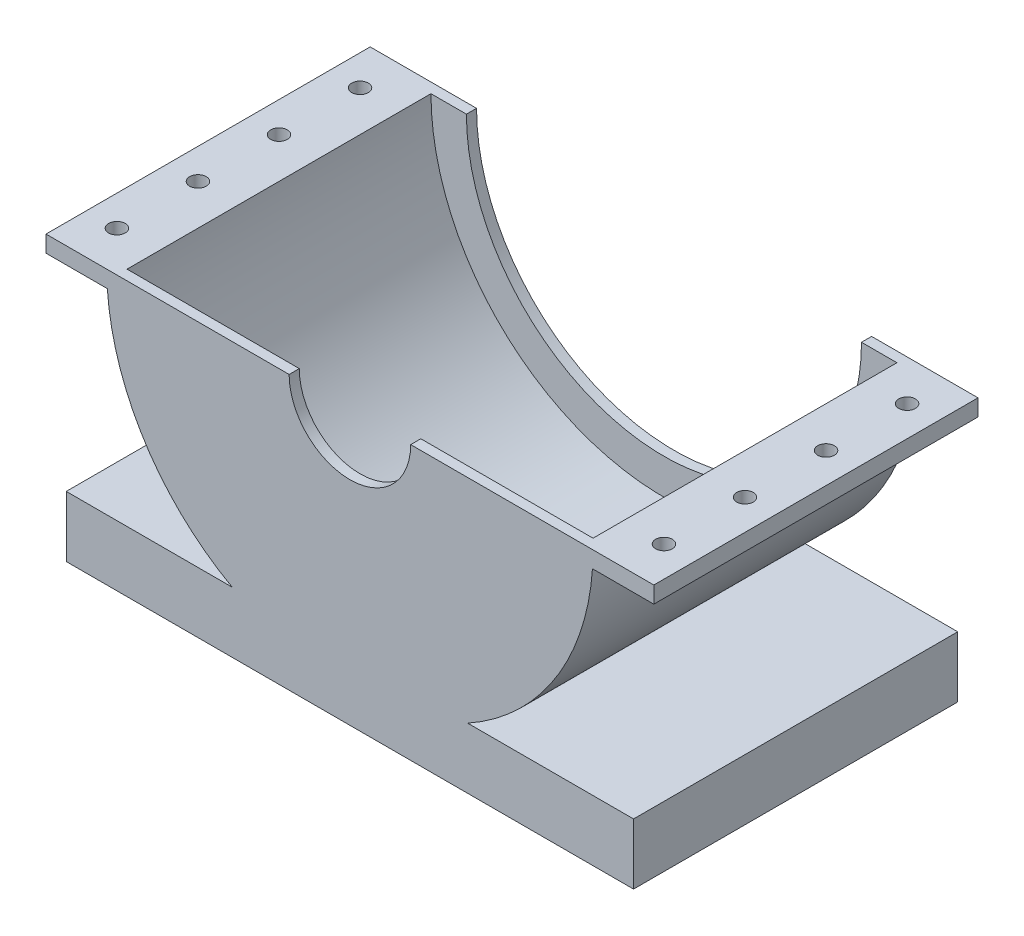
ISO-10303-21;
HEADER;
FILE_DESCRIPTION(('STEP AP214'),'2;1');
FILE_NAME('part.step','',(''),(''),'','','');
FILE_SCHEMA(('AUTOMOTIVE_DESIGN { 1 0 10303 214 1 1 1 1 }'));
ENDSEC;
DATA;
#1=APPLICATION_CONTEXT('core data for automotive mechanical design processes');
#2=APPLICATION_PROTOCOL_DEFINITION('international standard','automotive_design',2000,#1);
#3=PRODUCT_CONTEXT('',#1,'mechanical');
#4=PRODUCT('Part','Part','',(#3));
#5=PRODUCT_RELATED_PRODUCT_CATEGORY('part','',(#4));
#6=PRODUCT_DEFINITION_FORMATION('','',#4);
#7=PRODUCT_DEFINITION_CONTEXT('part definition',#1,'design');
#8=PRODUCT_DEFINITION('design','',#6,#7);
#9=PRODUCT_DEFINITION_SHAPE('','',#8);
#10=(LENGTH_UNIT() NAMED_UNIT(*) SI_UNIT(.MILLI.,.METRE.));
#11=(NAMED_UNIT(*) PLANE_ANGLE_UNIT() SI_UNIT($,.RADIAN.));
#12=(NAMED_UNIT(*) SI_UNIT($,.STERADIAN.) SOLID_ANGLE_UNIT());
#13=UNCERTAINTY_MEASURE_WITH_UNIT(LENGTH_MEASURE(1.E-05),#10,'distance_accuracy_value','');
#14=(GEOMETRIC_REPRESENTATION_CONTEXT(3) GLOBAL_UNCERTAINTY_ASSIGNED_CONTEXT((#13)) GLOBAL_UNIT_ASSIGNED_CONTEXT((#10,
#11,#12)) REPRESENTATION_CONTEXT('',''));
#15=CARTESIAN_POINT('',(0.,0.,0.));
#16=DIRECTION('',(0.,0.,1.));
#17=DIRECTION('',(1.,0.,0.));
#18=AXIS2_PLACEMENT_3D('',#15,#16,#17);
#19=CARTESIAN_POINT('',(0.,67.5,80.));
#20=DIRECTION('',(0.,0.,-1.));
#21=DIRECTION('',(-1.,0.,0.));
#22=AXIS2_PLACEMENT_3D('',#19,#20,#21);
#23=CYLINDRICAL_SURFACE('',#22,60.);
#24=CARTESIAN_POINT('',(0.,67.5,80.));
#25=DIRECTION('',(0.,0.,-1.));
#26=DIRECTION('',(-1.,0.,0.));
#27=AXIS2_PLACEMENT_3D('',#24,#25,#26);
#28=CIRCLE('',#27,60.);
#29=CARTESIAN_POINT('',(-29.0473750965557,15.,80.));
#30=VERTEX_POINT('',#29);
#31=CARTESIAN_POINT('',(-59.8597527559211,63.4,80.));
#32=VERTEX_POINT('',#31);
#33=EDGE_CURVE('E52',#30,#32,#28,.T.);
#34=ORIENTED_EDGE('',*,*,#33,.T.);
#35=DIRECTION('',(0.,0.,-1.));
#36=VECTOR('',#35,1.);
#37=CARTESIAN_POINT('',(-59.8597527559211,63.4,80.));
#38=LINE('',#37,#36);
#39=CARTESIAN_POINT('',(-59.8597527559211,63.4,0.));
#40=VERTEX_POINT('',#39);
#41=EDGE_CURVE('E47',#40,#32,#38,.F.);
#42=ORIENTED_EDGE('',*,*,#41,.F.);
#43=CARTESIAN_POINT('',(0.,67.5,0.));
#44=DIRECTION('',(0.,0.,-1.));
#45=DIRECTION('',(-1.,0.,0.));
#46=AXIS2_PLACEMENT_3D('',#43,#44,#45);
#47=CIRCLE('',#46,60.);
#48=CARTESIAN_POINT('',(-29.0473750965556,15.,0.));
#49=VERTEX_POINT('',#48);
#50=EDGE_CURVE('E281',#49,#40,#47,.T.);
#51=ORIENTED_EDGE('',*,*,#50,.F.);
#52=DIRECTION('',(0.,0.,-1.));
#53=VECTOR('',#52,1.);
#54=CARTESIAN_POINT('',(-29.0473750965557,15.,80.));
#55=LINE('',#54,#53);
#56=EDGE_CURVE('E314',#30,#49,#55,.T.);
#57=ORIENTED_EDGE('',*,*,#56,.F.);
#58=EDGE_LOOP('',(#34,#42,#51,#57));
#59=FACE_BOUND('',#58,.T.);
#60=ADVANCED_FACE('F32',(#59),#23,.T.);
#61=CARTESIAN_POINT('',(0.,67.5,80.));
#62=DIRECTION('',(0.,0.,-1.));
#63=DIRECTION('',(-1.,0.,0.));
#64=AXIS2_PLACEMENT_3D('',#61,#62,#63);
#65=CYLINDRICAL_SURFACE('',#64,57.5);
#66=DIRECTION('',(0.,0.,-1.));
#67=VECTOR('',#66,1.);
#68=CARTESIAN_POINT('',(-57.5,67.5,80.));
#69=LINE('',#68,#67);
#70=CARTESIAN_POINT('',(-57.5,67.5,77.5));
#71=VERTEX_POINT('',#70);
#72=CARTESIAN_POINT('',(-57.5,67.5,2.5));
#73=VERTEX_POINT('',#72);
#74=EDGE_CURVE('E285',#71,#73,#69,.T.);
#75=ORIENTED_EDGE('',*,*,#74,.F.);
#76=CARTESIAN_POINT('',(0.,67.5,77.5));
#77=DIRECTION('',(0.,0.,1.));
#78=DIRECTION('',(1.,0.,0.));
#79=AXIS2_PLACEMENT_3D('',#76,#77,#78);
#80=CIRCLE('',#79,57.5);
#81=CARTESIAN_POINT('',(57.5,67.5,77.5));
#82=VERTEX_POINT('',#81);
#83=EDGE_CURVE('E232',#71,#82,#80,.T.);
#84=ORIENTED_EDGE('',*,*,#83,.T.);
#85=DIRECTION('',(0.,0.,-1.));
#86=VECTOR('',#85,1.);
#87=CARTESIAN_POINT('',(57.5,67.5,80.));
#88=LINE('',#87,#86);
#89=CARTESIAN_POINT('',(57.5,67.5,2.5));
#90=VERTEX_POINT('',#89);
#91=EDGE_CURVE('E279',#82,#90,#88,.T.);
#92=ORIENTED_EDGE('',*,*,#91,.T.);
#93=CARTESIAN_POINT('',(0.,67.5,2.5));
#94=DIRECTION('',(0.,0.,-1.));
#95=DIRECTION('',(-1.,0.,0.));
#96=AXIS2_PLACEMENT_3D('',#93,#94,#95);
#97=CIRCLE('',#96,57.5);
#98=EDGE_CURVE('E258',#90,#73,#97,.T.);
#99=ORIENTED_EDGE('',*,*,#98,.T.);
#100=EDGE_LOOP('',(#75,#84,#92,#99));
#101=FACE_BOUND('',#100,.T.);
#102=ADVANCED_FACE('F351',(#101),#65,.F.);
#103=CARTESIAN_POINT('',(-70.,0.,80.));
#104=DIRECTION('',(1.,0.,0.));
#105=DIRECTION('',(0.,0.,-1.));
#106=AXIS2_PLACEMENT_3D('',#103,#104,#105);
#107=PLANE('',#106);
#108=DIRECTION('',(0.,-1.,0.));
#109=VECTOR('',#108,1.);
#110=CARTESIAN_POINT('',(-70.,0.,0.));
#111=LINE('',#110,#109);
#112=CARTESIAN_POINT('',(-70.,15.,0.));
#113=VERTEX_POINT('',#112);
#114=CARTESIAN_POINT('',(-70.,0.,0.));
#115=VERTEX_POINT('',#114);
#116=EDGE_CURVE('E287',#113,#115,#111,.T.);
#117=ORIENTED_EDGE('',*,*,#116,.T.);
#118=DIRECTION('',(0.,0.,-1.));
#119=VECTOR('',#118,1.);
#120=CARTESIAN_POINT('',(-70.,0.,80.));
#121=LINE('',#120,#119);
#122=CARTESIAN_POINT('',(-70.,0.,80.));
#123=VERTEX_POINT('',#122);
#124=EDGE_CURVE('E11',#123,#115,#121,.T.);
#125=ORIENTED_EDGE('',*,*,#124,.F.);
#126=DIRECTION('',(0.,-1.,0.));
#127=VECTOR('',#126,1.);
#128=CARTESIAN_POINT('',(-70.,0.,80.));
#129=LINE('',#128,#127);
#130=CARTESIAN_POINT('',(-70.,15.,80.));
#131=VERTEX_POINT('',#130);
#132=EDGE_CURVE('E289',#131,#123,#129,.T.);
#133=ORIENTED_EDGE('',*,*,#132,.F.);
#134=DIRECTION('',(0.,0.,-1.));
#135=VECTOR('',#134,1.);
#136=CARTESIAN_POINT('',(-70.,15.,80.));
#137=LINE('',#136,#135);
#138=EDGE_CURVE('E301',#131,#113,#137,.T.);
#139=ORIENTED_EDGE('',*,*,#138,.T.);
#140=EDGE_LOOP('',(#117,#125,#133,#139));
#141=FACE_BOUND('',#140,.T.);
#142=ADVANCED_FACE('F34',(#141),#107,.F.);
#143=CARTESIAN_POINT('',(-70.,0.,80.));
#144=DIRECTION('',(0.,1.,0.));
#145=DIRECTION('',(0.,0.,1.));
#146=AXIS2_PLACEMENT_3D('',#143,#144,#145);
#147=PLANE('',#146);
#148=DIRECTION('',(1.,0.,0.));
#149=VECTOR('',#148,1.);
#150=CARTESIAN_POINT('',(-70.,0.,0.));
#151=LINE('',#150,#149);
#152=CARTESIAN_POINT('',(70.,0.,0.));
#153=VERTEX_POINT('',#152);
#154=EDGE_CURVE('E304',#115,#153,#151,.T.);
#155=ORIENTED_EDGE('',*,*,#154,.T.);
#156=DIRECTION('',(0.,0.,-1.));
#157=VECTOR('',#156,1.);
#158=CARTESIAN_POINT('',(70.,0.,80.));
#159=LINE('',#158,#157);
#160=CARTESIAN_POINT('',(70.,0.,80.));
#161=VERTEX_POINT('',#160);
#162=EDGE_CURVE('E40',#161,#153,#159,.T.);
#163=ORIENTED_EDGE('',*,*,#162,.F.);
#164=DIRECTION('',(1.,0.,0.));
#165=VECTOR('',#164,1.);
#166=CARTESIAN_POINT('',(-70.,0.,80.));
#167=LINE('',#166,#165);
#168=EDGE_CURVE('E291',#123,#161,#167,.T.);
#169=ORIENTED_EDGE('',*,*,#168,.F.);
#170=ORIENTED_EDGE('',*,*,#124,.T.);
#171=EDGE_LOOP('',(#155,#163,#169,#170));
#172=FACE_BOUND('',#171,.T.);
#173=ADVANCED_FACE('F345',(#172),#147,.F.);
#174=CARTESIAN_POINT('',(70.,0.,80.));
#175=DIRECTION('',(-1.,0.,0.));
#176=DIRECTION('',(0.,0.,1.));
#177=AXIS2_PLACEMENT_3D('',#174,#175,#176);
#178=PLANE('',#177);
#179=DIRECTION('',(0.,1.,0.));
#180=VECTOR('',#179,1.);
#181=CARTESIAN_POINT('',(70.,0.,0.));
#182=LINE('',#181,#180);
#183=CARTESIAN_POINT('',(70.,15.,0.));
#184=VERTEX_POINT('',#183);
#185=EDGE_CURVE('E306',#153,#184,#182,.T.);
#186=ORIENTED_EDGE('',*,*,#185,.T.);
#187=DIRECTION('',(0.,0.,-1.));
#188=VECTOR('',#187,1.);
#189=CARTESIAN_POINT('',(70.,15.,80.));
#190=LINE('',#189,#188);
#191=CARTESIAN_POINT('',(70.,15.,80.));
#192=VERTEX_POINT('',#191);
#193=EDGE_CURVE('E320',#192,#184,#190,.T.);
#194=ORIENTED_EDGE('',*,*,#193,.F.);
#195=DIRECTION('',(0.,1.,0.));
#196=VECTOR('',#195,1.);
#197=CARTESIAN_POINT('',(70.,0.,80.));
#198=LINE('',#197,#196);
#199=EDGE_CURVE('E294',#161,#192,#198,.T.);
#200=ORIENTED_EDGE('',*,*,#199,.F.);
#201=ORIENTED_EDGE('',*,*,#162,.T.);
#202=EDGE_LOOP('',(#186,#194,#200,#201));
#203=FACE_BOUND('',#202,.T.);
#204=ADVANCED_FACE('F327',(#203),#178,.F.);
#205=CARTESIAN_POINT('',(29.0473750965556,15.,80.));
#206=DIRECTION('',(0.,-1.,0.));
#207=DIRECTION('',(0.,0.,-1.));
#208=AXIS2_PLACEMENT_3D('',#205,#206,#207);
#209=PLANE('',#208);
#210=DIRECTION('',(-1.,0.,0.));
#211=VECTOR('',#210,1.);
#212=CARTESIAN_POINT('',(29.0473750965556,15.,0.));
#213=LINE('',#212,#211);
#214=CARTESIAN_POINT('',(29.0473750965556,15.,0.));
#215=VERTEX_POINT('',#214);
#216=EDGE_CURVE('E308',#184,#215,#213,.T.);
#217=ORIENTED_EDGE('',*,*,#216,.T.);
#218=DIRECTION('',(0.,0.,-1.));
#219=VECTOR('',#218,1.);
#220=CARTESIAN_POINT('',(29.0473750965556,15.,80.));
#221=LINE('',#220,#219);
#222=CARTESIAN_POINT('',(29.0473750965556,15.,80.));
#223=VERTEX_POINT('',#222);
#224=EDGE_CURVE('E317',#223,#215,#221,.T.);
#225=ORIENTED_EDGE('',*,*,#224,.F.);
#226=DIRECTION('',(-1.,0.,0.));
#227=VECTOR('',#226,1.);
#228=CARTESIAN_POINT('',(29.0473750965556,15.,80.));
#229=LINE('',#228,#227);
#230=EDGE_CURVE('E296',#192,#223,#229,.T.);
#231=ORIENTED_EDGE('',*,*,#230,.F.);
#232=ORIENTED_EDGE('',*,*,#193,.T.);
#233=EDGE_LOOP('',(#217,#225,#231,#232));
#234=FACE_BOUND('',#233,.T.);
#235=ADVANCED_FACE('F337',(#234),#209,.F.);
#236=CARTESIAN_POINT('',(-70.,15.,80.));
#237=DIRECTION('',(0.,-1.,0.));
#238=DIRECTION('',(0.,0.,-1.));
#239=AXIS2_PLACEMENT_3D('',#236,#237,#238);
#240=PLANE('',#239);
#241=DIRECTION('',(-1.,0.,0.));
#242=VECTOR('',#241,1.);
#243=CARTESIAN_POINT('',(-70.,15.,0.));
#244=LINE('',#243,#242);
#245=EDGE_CURVE('E292',#49,#113,#244,.T.);
#246=ORIENTED_EDGE('',*,*,#245,.T.);
#247=ORIENTED_EDGE('',*,*,#138,.F.);
#248=DIRECTION('',(-1.,0.,0.));
#249=VECTOR('',#248,1.);
#250=CARTESIAN_POINT('',(-70.,15.,80.));
#251=LINE('',#250,#249);
#252=EDGE_CURVE('E299',#30,#131,#251,.T.);
#253=ORIENTED_EDGE('',*,*,#252,.F.);
#254=ORIENTED_EDGE('',*,*,#56,.T.);
#255=EDGE_LOOP('',(#246,#247,#253,#254));
#256=FACE_BOUND('',#255,.T.);
#257=ADVANCED_FACE('F349',(#256),#240,.F.);
#258=CARTESIAN_POINT('',(0.,67.5,80.));
#259=DIRECTION('',(0.,0.,1.));
#260=DIRECTION('',(1.,0.,0.));
#261=AXIS2_PLACEMENT_3D('',#258,#259,#260);
#262=PLANE('',#261);
#263=ORIENTED_EDGE('',*,*,#132,.T.);
#264=ORIENTED_EDGE('',*,*,#168,.T.);
#265=ORIENTED_EDGE('',*,*,#199,.T.);
#266=ORIENTED_EDGE('',*,*,#230,.T.);
#267=CARTESIAN_POINT('',(59.8597527559211,63.4,80.));
#268=VERTEX_POINT('',#267);
#269=EDGE_CURVE('E276',#268,#223,#28,.T.);
#270=ORIENTED_EDGE('',*,*,#269,.F.);
#271=DIRECTION('',(1.,0.,0.));
#272=VECTOR('',#271,1.);
#273=CARTESIAN_POINT('',(-70.001,63.4,80.));
#274=LINE('',#273,#272);
#275=CARTESIAN_POINT('',(75.,63.4,80.));
#276=VERTEX_POINT('',#275);
#277=EDGE_CURVE('E224',#268,#276,#274,.T.);
#278=ORIENTED_EDGE('',*,*,#277,.T.);
#279=DIRECTION('',(0.,-1.,0.));
#280=VECTOR('',#279,1.);
#281=CARTESIAN_POINT('',(75.,67.5,80.));
#282=LINE('',#281,#280);
#283=CARTESIAN_POINT('',(75.,67.5,80.));
#284=VERTEX_POINT('',#283);
#285=EDGE_CURVE('E210',#284,#276,#282,.T.);
#286=ORIENTED_EDGE('',*,*,#285,.F.);
#287=DIRECTION('',(1.,0.,0.));
#288=VECTOR('',#287,1.);
#289=CARTESIAN_POINT('',(60.,67.5,80.));
#290=LINE('',#289,#288);
#291=CARTESIAN_POINT('',(15.,67.5,80.));
#292=VERTEX_POINT('',#291);
#293=EDGE_CURVE('E273',#292,#284,#290,.T.);
#294=ORIENTED_EDGE('',*,*,#293,.F.);
#295=CARTESIAN_POINT('',(0.,67.5,80.));
#296=DIRECTION('',(0.,0.,-1.));
#297=DIRECTION('',(1.,0.,0.));
#298=AXIS2_PLACEMENT_3D('',#295,#296,#297);
#299=CIRCLE('',#298,15.);
#300=CARTESIAN_POINT('',(-15.,67.5,80.));
#301=VERTEX_POINT('',#300);
#302=EDGE_CURVE('E231',#292,#301,#299,.T.);
#303=ORIENTED_EDGE('',*,*,#302,.T.);
#304=DIRECTION('',(1.,0.,0.));
#305=VECTOR('',#304,1.);
#306=CARTESIAN_POINT('',(-57.5,67.5,80.));
#307=LINE('',#306,#305);
#308=CARTESIAN_POINT('',(-75.,67.5,80.));
#309=VERTEX_POINT('',#308);
#310=EDGE_CURVE('E178',#309,#301,#307,.T.);
#311=ORIENTED_EDGE('',*,*,#310,.F.);
#312=DIRECTION('',(0.,-1.,0.));
#313=VECTOR('',#312,1.);
#314=CARTESIAN_POINT('',(-75.,67.5,80.));
#315=LINE('',#314,#313);
#316=CARTESIAN_POINT('',(-75.,63.4,80.));
#317=VERTEX_POINT('',#316);
#318=EDGE_CURVE('E170',#309,#317,#315,.T.);
#319=ORIENTED_EDGE('',*,*,#318,.T.);
#320=DIRECTION('',(-1.,0.,0.));
#321=VECTOR('',#320,1.);
#322=CARTESIAN_POINT('',(75.001,63.4,80.));
#323=LINE('',#322,#321);
#324=EDGE_CURVE('E157',#32,#317,#323,.T.);
#325=ORIENTED_EDGE('',*,*,#324,.F.);
#326=ORIENTED_EDGE('',*,*,#33,.F.);
#327=ORIENTED_EDGE('',*,*,#252,.T.);
#328=EDGE_LOOP('',(#263,#264,#265,#266,#270,#278,#286,#294,#303,#311,#319,#325,#326,#327));
#329=FACE_BOUND('',#328,.T.);
#330=ADVANCED_FACE('F176',(#329),#262,.T.);
#331=CARTESIAN_POINT('',(0.,67.5,0.));
#332=DIRECTION('',(0.,0.,1.));
#333=DIRECTION('',(1.,0.,0.));
#334=AXIS2_PLACEMENT_3D('',#331,#332,#333);
#335=PLANE('',#334);
#336=ORIENTED_EDGE('',*,*,#116,.F.);
#337=ORIENTED_EDGE('',*,*,#245,.F.);
#338=ORIENTED_EDGE('',*,*,#50,.T.);
#339=DIRECTION('',(-1.,0.,0.));
#340=VECTOR('',#339,1.);
#341=CARTESIAN_POINT('',(75.001,63.4,0.));
#342=LINE('',#341,#340);
#343=CARTESIAN_POINT('',(-75.,63.4,0.));
#344=VERTEX_POINT('',#343);
#345=EDGE_CURVE('E186',#40,#344,#342,.T.);
#346=ORIENTED_EDGE('',*,*,#345,.T.);
#347=DIRECTION('',(0.,1.,0.));
#348=VECTOR('',#347,1.);
#349=CARTESIAN_POINT('',(-75.,67.5,0.));
#350=LINE('',#349,#348);
#351=CARTESIAN_POINT('',(-75.,67.5,0.));
#352=VERTEX_POINT('',#351);
#353=EDGE_CURVE('E172',#344,#352,#350,.T.);
#354=ORIENTED_EDGE('',*,*,#353,.T.);
#355=DIRECTION('',(1.,0.,0.));
#356=VECTOR('',#355,1.);
#357=CARTESIAN_POINT('',(-57.5,67.5,0.));
#358=LINE('',#357,#356);
#359=CARTESIAN_POINT('',(-48.75,67.5,0.));
#360=VERTEX_POINT('',#359);
#361=EDGE_CURVE('E275',#352,#360,#358,.T.);
#362=ORIENTED_EDGE('',*,*,#361,.T.);
#363=CARTESIAN_POINT('',(0.,67.5,0.));
#364=DIRECTION('',(0.,0.,1.));
#365=DIRECTION('',(-1.,0.,0.));
#366=AXIS2_PLACEMENT_3D('',#363,#364,#365);
#367=CIRCLE('',#366,48.75);
#368=CARTESIAN_POINT('',(48.75,67.5,0.));
#369=VERTEX_POINT('',#368);
#370=EDGE_CURVE('E249',#360,#369,#367,.T.);
#371=ORIENTED_EDGE('',*,*,#370,.T.);
#372=DIRECTION('',(1.,0.,0.));
#373=VECTOR('',#372,1.);
#374=CARTESIAN_POINT('',(60.,67.5,0.));
#375=LINE('',#374,#373);
#376=CARTESIAN_POINT('',(75.,67.5,0.));
#377=VERTEX_POINT('',#376);
#378=EDGE_CURVE('E270',#369,#377,#375,.T.);
#379=ORIENTED_EDGE('',*,*,#378,.T.);
#380=DIRECTION('',(0.,1.,0.));
#381=VECTOR('',#380,1.);
#382=CARTESIAN_POINT('',(75.,67.5,0.));
#383=LINE('',#382,#381);
#384=CARTESIAN_POINT('',(75.,63.4,0.));
#385=VERTEX_POINT('',#384);
#386=EDGE_CURVE('E218',#385,#377,#383,.T.);
#387=ORIENTED_EDGE('',*,*,#386,.F.);
#388=DIRECTION('',(1.,0.,0.));
#389=VECTOR('',#388,1.);
#390=CARTESIAN_POINT('',(-70.001,63.4,0.));
#391=LINE('',#390,#389);
#392=CARTESIAN_POINT('',(59.8597527559211,63.4,0.));
#393=VERTEX_POINT('',#392);
#394=EDGE_CURVE('E225',#393,#385,#391,.T.);
#395=ORIENTED_EDGE('',*,*,#394,.F.);
#396=EDGE_CURVE('E282',#393,#215,#47,.T.);
#397=ORIENTED_EDGE('',*,*,#396,.T.);
#398=ORIENTED_EDGE('',*,*,#216,.F.);
#399=ORIENTED_EDGE('',*,*,#185,.F.);
#400=ORIENTED_EDGE('',*,*,#154,.F.);
#401=EDGE_LOOP('',(#336,#337,#338,#346,#354,#362,#371,#379,#387,#395,#397,#398,#399,#400));
#402=FACE_BOUND('',#401,.T.);
#403=ADVANCED_FACE('F333',(#402),#335,.F.);
#404=DIRECTION('',(0.,0.,-1.));
#405=VECTOR('',#404,1.);
#406=CARTESIAN_POINT('',(59.8597527559211,63.4,80.));
#407=LINE('',#406,#405);
#408=EDGE_CURVE('E227',#393,#268,#407,.F.);
#409=ORIENTED_EDGE('',*,*,#408,.T.);
#410=ORIENTED_EDGE('',*,*,#269,.T.);
#411=ORIENTED_EDGE('',*,*,#224,.T.);
#412=ORIENTED_EDGE('',*,*,#396,.F.);
#413=EDGE_LOOP('',(#409,#410,#411,#412));
#414=FACE_BOUND('',#413,.T.);
#415=ADVANCED_FACE('F340',(#414),#23,.T.);
#416=CARTESIAN_POINT('',(-57.5,67.5,80.));
#417=DIRECTION('',(0.,1.,0.));
#418=DIRECTION('',(0.,0.,1.));
#419=AXIS2_PLACEMENT_3D('',#416,#417,#418);
#420=PLANE('',#419);
#421=CARTESIAN_POINT('',(-67.4999999999999,67.5,50.));
#422=DIRECTION('',(0.,-1.,0.));
#423=DIRECTION('',(0.,0.,1.));
#424=AXIS2_PLACEMENT_3D('',#421,#422,#423);
#425=CIRCLE('',#424,2.04999999999999);
#426=CARTESIAN_POINT('',(-67.4999999999999,67.5,52.05));
#427=VERTEX_POINT('',#426);
#428=EDGE_CURVE('E620',#427,#427,#425,.T.);
#429=ORIENTED_EDGE('',*,*,#428,.T.);
#430=EDGE_LOOP('',(#429));
#431=FACE_BOUND('',#430,.T.);
#432=CARTESIAN_POINT('',(-67.4999999999999,67.5,30.));
#433=DIRECTION('',(0.,-1.,0.));
#434=DIRECTION('',(0.,0.,1.));
#435=AXIS2_PLACEMENT_3D('',#432,#433,#434);
#436=CIRCLE('',#435,2.04999999999999);
#437=CARTESIAN_POINT('',(-67.4999999999999,67.5,32.05));
#438=VERTEX_POINT('',#437);
#439=EDGE_CURVE('E614',#438,#438,#436,.T.);
#440=ORIENTED_EDGE('',*,*,#439,.T.);
#441=EDGE_LOOP('',(#440));
#442=FACE_BOUND('',#441,.T.);
#443=CARTESIAN_POINT('',(-67.4999999999998,67.5,10.));
#444=DIRECTION('',(0.,-1.,0.));
#445=DIRECTION('',(0.,0.,1.));
#446=AXIS2_PLACEMENT_3D('',#443,#444,#445);
#447=CIRCLE('',#446,2.04999999999999);
#448=CARTESIAN_POINT('',(-67.4999999999998,67.5,12.05));
#449=VERTEX_POINT('',#448);
#450=EDGE_CURVE('E608',#449,#449,#447,.T.);
#451=ORIENTED_EDGE('',*,*,#450,.T.);
#452=EDGE_LOOP('',(#451));
#453=FACE_BOUND('',#452,.T.);
#454=CARTESIAN_POINT('',(-67.5,67.5,70.));
#455=DIRECTION('',(0.,-1.,0.));
#456=DIRECTION('',(0.,0.,1.));
#457=AXIS2_PLACEMENT_3D('',#454,#455,#456);
#458=CIRCLE('',#457,2.04999999999999);
#459=CARTESIAN_POINT('',(-67.5,67.5,72.05));
#460=VERTEX_POINT('',#459);
#461=EDGE_CURVE('E602',#460,#460,#458,.T.);
#462=ORIENTED_EDGE('',*,*,#461,.T.);
#463=EDGE_LOOP('',(#462));
#464=FACE_BOUND('',#463,.T.);
#465=ORIENTED_EDGE('',*,*,#361,.F.);
#466=DIRECTION('',(0.,0.,1.));
#467=VECTOR('',#466,1.);
#468=CARTESIAN_POINT('',(-75.,67.5,80.));
#469=LINE('',#468,#467);
#470=EDGE_CURVE('E180',#352,#309,#469,.T.);
#471=ORIENTED_EDGE('',*,*,#470,.T.);
#472=ORIENTED_EDGE('',*,*,#310,.T.);
#473=DIRECTION('',(0.,0.,1.));
#474=VECTOR('',#473,1.);
#475=CARTESIAN_POINT('',(-15.,67.5,77.5));
#476=LINE('',#475,#474);
#477=CARTESIAN_POINT('',(-15.,67.5,77.5));
#478=VERTEX_POINT('',#477);
#479=EDGE_CURVE('E246',#478,#301,#476,.T.);
#480=ORIENTED_EDGE('',*,*,#479,.F.);
#481=DIRECTION('',(-1.,0.,0.));
#482=VECTOR('',#481,1.);
#483=CARTESIAN_POINT('',(-57.5,67.5,77.5));
#484=LINE('',#483,#482);
#485=EDGE_CURVE('E241',#478,#71,#484,.T.);
#486=ORIENTED_EDGE('',*,*,#485,.T.);
#487=ORIENTED_EDGE('',*,*,#74,.T.);
#488=DIRECTION('',(1.,0.,0.));
#489=VECTOR('',#488,1.);
#490=CARTESIAN_POINT('',(-48.75,67.5,2.5));
#491=LINE('',#490,#489);
#492=CARTESIAN_POINT('',(-48.75,67.5,2.5));
#493=VERTEX_POINT('',#492);
#494=EDGE_CURVE('E261',#73,#493,#491,.T.);
#495=ORIENTED_EDGE('',*,*,#494,.T.);
#496=DIRECTION('',(0.,0.,-1.));
#497=VECTOR('',#496,1.);
#498=CARTESIAN_POINT('',(-48.75,67.5,2.5));
#499=LINE('',#498,#497);
#500=EDGE_CURVE('E267',#493,#360,#499,.T.);
#501=ORIENTED_EDGE('',*,*,#500,.T.);
#502=EDGE_LOOP('',(#465,#471,#472,#480,#486,#487,#495,#501));
#503=FACE_BOUND('',#502,.T.);
#504=ADVANCED_FACE('F361',(#431,#442,#453,#464,#503),#420,.T.);
#505=CARTESIAN_POINT('',(60.,67.5,80.));
#506=DIRECTION('',(0.,1.,0.));
#507=DIRECTION('',(0.,0.,1.));
#508=AXIS2_PLACEMENT_3D('',#505,#506,#507);
#509=PLANE('',#508);
#510=CARTESIAN_POINT('',(67.4999999999999,67.5,50.));
#511=DIRECTION('',(0.,1.,0.));
#512=DIRECTION('',(0.,0.,1.));
#513=AXIS2_PLACEMENT_3D('',#510,#511,#512);
#514=CIRCLE('',#513,2.04999999999999);
#515=CARTESIAN_POINT('',(67.4999999999999,67.5,52.05));
#516=VERTEX_POINT('',#515);
#517=EDGE_CURVE('E193',#516,#516,#514,.T.);
#518=ORIENTED_EDGE('',*,*,#517,.F.);
#519=EDGE_LOOP('',(#518));
#520=FACE_BOUND('',#519,.T.);
#521=CARTESIAN_POINT('',(67.4999999999999,67.5,30.));
#522=DIRECTION('',(0.,1.,0.));
#523=DIRECTION('',(0.,0.,1.));
#524=AXIS2_PLACEMENT_3D('',#521,#522,#523);
#525=CIRCLE('',#524,2.04999999999999);
#526=CARTESIAN_POINT('',(67.4999999999999,67.5,32.05));
#527=VERTEX_POINT('',#526);
#528=EDGE_CURVE('E199',#527,#527,#525,.T.);
#529=ORIENTED_EDGE('',*,*,#528,.F.);
#530=EDGE_LOOP('',(#529));
#531=FACE_BOUND('',#530,.T.);
#532=CARTESIAN_POINT('',(67.4999999999998,67.5,10.));
#533=DIRECTION('',(0.,1.,0.));
#534=DIRECTION('',(0.,0.,1.));
#535=AXIS2_PLACEMENT_3D('',#532,#533,#534);
#536=CIRCLE('',#535,2.04999999999999);
#537=CARTESIAN_POINT('',(67.4999999999998,67.5,12.05));
#538=VERTEX_POINT('',#537);
#539=EDGE_CURVE('E173',#538,#538,#536,.T.);
#540=ORIENTED_EDGE('',*,*,#539,.F.);
#541=EDGE_LOOP('',(#540));
#542=FACE_BOUND('',#541,.T.);
#543=CARTESIAN_POINT('',(67.5,67.5,70.));
#544=DIRECTION('',(0.,1.,0.));
#545=DIRECTION('',(0.,0.,1.));
#546=AXIS2_PLACEMENT_3D('',#543,#544,#545);
#547=CIRCLE('',#546,2.04999999999999);
#548=CARTESIAN_POINT('',(67.5,67.5,72.05));
#549=VERTEX_POINT('',#548);
#550=EDGE_CURVE('E192',#549,#549,#547,.T.);
#551=ORIENTED_EDGE('',*,*,#550,.F.);
#552=EDGE_LOOP('',(#551));
#553=FACE_BOUND('',#552,.T.);
#554=ORIENTED_EDGE('',*,*,#378,.F.);
#555=DIRECTION('',(0.,0.,-1.));
#556=VECTOR('',#555,1.);
#557=CARTESIAN_POINT('',(48.75,67.5,2.5));
#558=LINE('',#557,#556);
#559=CARTESIAN_POINT('',(48.75,67.5,2.5));
#560=VERTEX_POINT('',#559);
#561=EDGE_CURVE('E264',#560,#369,#558,.T.);
#562=ORIENTED_EDGE('',*,*,#561,.F.);
#563=DIRECTION('',(1.,0.,0.));
#564=VECTOR('',#563,1.);
#565=CARTESIAN_POINT('',(57.5,67.5,2.5));
#566=LINE('',#565,#564);
#567=EDGE_CURVE('E255',#560,#90,#566,.T.);
#568=ORIENTED_EDGE('',*,*,#567,.T.);
#569=ORIENTED_EDGE('',*,*,#91,.F.);
#570=DIRECTION('',(-1.,0.,0.));
#571=VECTOR('',#570,1.);
#572=CARTESIAN_POINT('',(15.,67.5,77.5));
#573=LINE('',#572,#571);
#574=CARTESIAN_POINT('',(15.,67.5,77.5));
#575=VERTEX_POINT('',#574);
#576=EDGE_CURVE('E235',#82,#575,#573,.T.);
#577=ORIENTED_EDGE('',*,*,#576,.T.);
#578=DIRECTION('',(0.,0.,1.));
#579=VECTOR('',#578,1.);
#580=CARTESIAN_POINT('',(15.,67.5,77.5));
#581=LINE('',#580,#579);
#582=EDGE_CURVE('E244',#575,#292,#581,.T.);
#583=ORIENTED_EDGE('',*,*,#582,.T.);
#584=ORIENTED_EDGE('',*,*,#293,.T.);
#585=DIRECTION('',(0.,0.,1.));
#586=VECTOR('',#585,1.);
#587=CARTESIAN_POINT('',(75.,67.5,80.));
#588=LINE('',#587,#586);
#589=EDGE_CURVE('E221',#377,#284,#588,.T.);
#590=ORIENTED_EDGE('',*,*,#589,.F.);
#591=EDGE_LOOP('',(#554,#562,#568,#569,#577,#583,#584,#590));
#592=FACE_BOUND('',#591,.T.);
#593=ADVANCED_FACE('F366',(#520,#531,#542,#553,#592),#509,.T.);
#594=CARTESIAN_POINT('',(0.,67.5,2.5));
#595=DIRECTION('',(0.,0.,-1.));
#596=DIRECTION('',(-1.,0.,0.));
#597=AXIS2_PLACEMENT_3D('',#594,#595,#596);
#598=CYLINDRICAL_SURFACE('',#597,48.75);
#599=ORIENTED_EDGE('',*,*,#370,.F.);
#600=ORIENTED_EDGE('',*,*,#500,.F.);
#601=CARTESIAN_POINT('',(0.,67.5,2.5));
#602=DIRECTION('',(0.,0.,1.));
#603=DIRECTION('',(-1.,0.,0.));
#604=AXIS2_PLACEMENT_3D('',#601,#602,#603);
#605=CIRCLE('',#604,48.75);
#606=EDGE_CURVE('E252',#493,#560,#605,.T.);
#607=ORIENTED_EDGE('',*,*,#606,.T.);
#608=ORIENTED_EDGE('',*,*,#561,.T.);
#609=EDGE_LOOP('',(#599,#600,#607,#608));
#610=FACE_BOUND('',#609,.T.);
#611=ADVANCED_FACE('F449',(#610),#598,.F.);
#612=CARTESIAN_POINT('',(0.,67.5,2.5));
#613=DIRECTION('',(0.,0.,-1.));
#614=DIRECTION('',(-1.,0.,0.));
#615=AXIS2_PLACEMENT_3D('',#612,#613,#614);
#616=PLANE('',#615);
#617=ORIENTED_EDGE('',*,*,#606,.F.);
#618=ORIENTED_EDGE('',*,*,#494,.F.);
#619=ORIENTED_EDGE('',*,*,#98,.F.);
#620=ORIENTED_EDGE('',*,*,#567,.F.);
#621=EDGE_LOOP('',(#617,#618,#619,#620));
#622=FACE_BOUND('',#621,.T.);
#623=ADVANCED_FACE('F397',(#622),#616,.F.);
#624=CARTESIAN_POINT('',(0.,67.5,77.5));
#625=DIRECTION('',(0.,0.,1.));
#626=DIRECTION('',(1.,0.,0.));
#627=AXIS2_PLACEMENT_3D('',#624,#625,#626);
#628=CYLINDRICAL_SURFACE('',#627,15.);
#629=ORIENTED_EDGE('',*,*,#302,.F.);
#630=ORIENTED_EDGE('',*,*,#582,.F.);
#631=CARTESIAN_POINT('',(0.,67.5,77.5));
#632=DIRECTION('',(0.,0.,-1.));
#633=DIRECTION('',(1.,0.,0.));
#634=AXIS2_PLACEMENT_3D('',#631,#632,#633);
#635=CIRCLE('',#634,15.);
#636=EDGE_CURVE('E238',#575,#478,#635,.T.);
#637=ORIENTED_EDGE('',*,*,#636,.T.);
#638=ORIENTED_EDGE('',*,*,#479,.T.);
#639=EDGE_LOOP('',(#629,#630,#637,#638));
#640=FACE_BOUND('',#639,.T.);
#641=ADVANCED_FACE('F401',(#640),#628,.F.);
#642=CARTESIAN_POINT('',(0.,67.5,77.5));
#643=DIRECTION('',(0.,0.,1.));
#644=DIRECTION('',(1.,0.,0.));
#645=AXIS2_PLACEMENT_3D('',#642,#643,#644);
#646=PLANE('',#645);
#647=ORIENTED_EDGE('',*,*,#83,.F.);
#648=ORIENTED_EDGE('',*,*,#485,.F.);
#649=ORIENTED_EDGE('',*,*,#636,.F.);
#650=ORIENTED_EDGE('',*,*,#576,.F.);
#651=EDGE_LOOP('',(#647,#648,#649,#650));
#652=FACE_BOUND('',#651,.T.);
#653=ADVANCED_FACE('F406',(#652),#646,.F.);
#654=CARTESIAN_POINT('',(-70.001,63.4,80.));
#655=DIRECTION('',(0.,-1.,0.));
#656=DIRECTION('',(0.,0.,-1.));
#657=AXIS2_PLACEMENT_3D('',#654,#655,#656);
#658=PLANE('',#657);
#659=CARTESIAN_POINT('',(67.4999999999999,63.4,50.));
#660=DIRECTION('',(0.,1.,0.));
#661=DIRECTION('',(0.,0.,1.));
#662=AXIS2_PLACEMENT_3D('',#659,#660,#661);
#663=CIRCLE('',#662,2.04999999999999);
#664=CARTESIAN_POINT('',(67.4999999999999,63.4,52.05));
#665=VERTEX_POINT('',#664);
#666=EDGE_CURVE('E189',#665,#665,#663,.T.);
#667=ORIENTED_EDGE('',*,*,#666,.T.);
#668=EDGE_LOOP('',(#667));
#669=FACE_BOUND('',#668,.T.);
#670=CARTESIAN_POINT('',(67.4999999999999,63.4,30.));
#671=DIRECTION('',(0.,1.,0.));
#672=DIRECTION('',(0.,0.,1.));
#673=AXIS2_PLACEMENT_3D('',#670,#671,#672);
#674=CIRCLE('',#673,2.04999999999999);
#675=CARTESIAN_POINT('',(67.4999999999999,63.4,32.05));
#676=VERTEX_POINT('',#675);
#677=EDGE_CURVE('E196',#676,#676,#674,.T.);
#678=ORIENTED_EDGE('',*,*,#677,.T.);
#679=EDGE_LOOP('',(#678));
#680=FACE_BOUND('',#679,.T.);
#681=CARTESIAN_POINT('',(67.4999999999998,63.4,10.));
#682=DIRECTION('',(0.,1.,0.));
#683=DIRECTION('',(0.,0.,1.));
#684=AXIS2_PLACEMENT_3D('',#681,#682,#683);
#685=CIRCLE('',#684,2.04999999999999);
#686=CARTESIAN_POINT('',(67.4999999999998,63.4,12.05));
#687=VERTEX_POINT('',#686);
#688=EDGE_CURVE('E202',#687,#687,#685,.T.);
#689=ORIENTED_EDGE('',*,*,#688,.T.);
#690=EDGE_LOOP('',(#689));
#691=FACE_BOUND('',#690,.T.);
#692=CARTESIAN_POINT('',(67.5,63.4,70.));
#693=DIRECTION('',(0.,1.,0.));
#694=DIRECTION('',(0.,0.,1.));
#695=AXIS2_PLACEMENT_3D('',#692,#693,#694);
#696=CIRCLE('',#695,2.04999999999999);
#697=CARTESIAN_POINT('',(67.5,63.4,72.05));
#698=VERTEX_POINT('',#697);
#699=EDGE_CURVE('E207',#698,#698,#696,.T.);
#700=ORIENTED_EDGE('',*,*,#699,.T.);
#701=EDGE_LOOP('',(#700));
#702=FACE_BOUND('',#701,.T.);
#703=ORIENTED_EDGE('',*,*,#408,.F.);
#704=ORIENTED_EDGE('',*,*,#394,.T.);
#705=DIRECTION('',(0.,0.,-1.));
#706=VECTOR('',#705,1.);
#707=CARTESIAN_POINT('',(75.,63.4,80.));
#708=LINE('',#707,#706);
#709=EDGE_CURVE('E215',#276,#385,#708,.T.);
#710=ORIENTED_EDGE('',*,*,#709,.F.);
#711=ORIENTED_EDGE('',*,*,#277,.F.);
#712=EDGE_LOOP('',(#703,#704,#710,#711));
#713=FACE_BOUND('',#712,.T.);
#714=ADVANCED_FACE('F416',(#669,#680,#691,#702,#713),#658,.T.);
#715=CARTESIAN_POINT('',(75.,0.,0.));
#716=DIRECTION('',(1.,0.,0.));
#717=DIRECTION('',(0.,0.,-1.));
#718=AXIS2_PLACEMENT_3D('',#715,#716,#717);
#719=PLANE('',#718);
#720=ORIENTED_EDGE('',*,*,#285,.T.);
#721=ORIENTED_EDGE('',*,*,#709,.T.);
#722=ORIENTED_EDGE('',*,*,#386,.T.);
#723=ORIENTED_EDGE('',*,*,#589,.T.);
#724=EDGE_LOOP('',(#720,#721,#722,#723));
#725=FACE_BOUND('',#724,.T.);
#726=ADVANCED_FACE('F431',(#725),#719,.T.);
#727=CARTESIAN_POINT('',(67.5,63.4,70.));
#728=DIRECTION('',(0.,1.,0.));
#729=DIRECTION('',(0.,0.,1.));
#730=AXIS2_PLACEMENT_3D('',#727,#728,#729);
#731=CYLINDRICAL_SURFACE('',#730,2.04999999999999);
#732=ORIENTED_EDGE('',*,*,#699,.F.);
#733=EDGE_LOOP('',(#732));
#734=FACE_BOUND('',#733,.T.);
#735=ORIENTED_EDGE('',*,*,#550,.T.);
#736=EDGE_LOOP('',(#735));
#737=FACE_BOUND('',#736,.T.);
#738=ADVANCED_FACE('F436',(#734,#737),#731,.F.);
#739=CARTESIAN_POINT('',(67.4999999999998,63.4,10.));
#740=DIRECTION('',(0.,1.,0.));
#741=DIRECTION('',(0.,0.,1.));
#742=AXIS2_PLACEMENT_3D('',#739,#740,#741);
#743=CYLINDRICAL_SURFACE('',#742,2.04999999999999);
#744=ORIENTED_EDGE('',*,*,#688,.F.);
#745=EDGE_LOOP('',(#744));
#746=FACE_BOUND('',#745,.T.);
#747=ORIENTED_EDGE('',*,*,#539,.T.);
#748=EDGE_LOOP('',(#747));
#749=FACE_BOUND('',#748,.T.);
#750=ADVANCED_FACE('F465',(#746,#749),#743,.F.);
#751=CARTESIAN_POINT('',(67.4999999999999,63.4,30.));
#752=DIRECTION('',(0.,1.,0.));
#753=DIRECTION('',(0.,0.,1.));
#754=AXIS2_PLACEMENT_3D('',#751,#752,#753);
#755=CYLINDRICAL_SURFACE('',#754,2.04999999999999);
#756=ORIENTED_EDGE('',*,*,#677,.F.);
#757=EDGE_LOOP('',(#756));
#758=FACE_BOUND('',#757,.T.);
#759=ORIENTED_EDGE('',*,*,#528,.T.);
#760=EDGE_LOOP('',(#759));
#761=FACE_BOUND('',#760,.T.);
#762=ADVANCED_FACE('F475',(#758,#761),#755,.F.);
#763=CARTESIAN_POINT('',(67.4999999999999,63.4,50.));
#764=DIRECTION('',(0.,1.,0.));
#765=DIRECTION('',(0.,0.,1.));
#766=AXIS2_PLACEMENT_3D('',#763,#764,#765);
#767=CYLINDRICAL_SURFACE('',#766,2.04999999999999);
#768=ORIENTED_EDGE('',*,*,#666,.F.);
#769=EDGE_LOOP('',(#768));
#770=FACE_BOUND('',#769,.T.);
#771=ORIENTED_EDGE('',*,*,#517,.T.);
#772=EDGE_LOOP('',(#771));
#773=FACE_BOUND('',#772,.T.);
#774=ADVANCED_FACE('F485',(#770,#773),#767,.F.);
#775=CARTESIAN_POINT('',(75.001,63.4,80.));
#776=DIRECTION('',(0.,1.,0.));
#777=DIRECTION('',(0.,0.,1.));
#778=AXIS2_PLACEMENT_3D('',#775,#776,#777);
#779=PLANE('',#778);
#780=CARTESIAN_POINT('',(-67.4999999999999,63.4,50.));
#781=DIRECTION('',(0.,-1.,0.));
#782=DIRECTION('',(0.,0.,1.));
#783=AXIS2_PLACEMENT_3D('',#780,#781,#782);
#784=CIRCLE('',#783,2.04999999999999);
#785=CARTESIAN_POINT('',(-67.4999999999999,63.4,52.05));
#786=VERTEX_POINT('',#785);
#787=EDGE_CURVE('E605',#786,#786,#784,.T.);
#788=ORIENTED_EDGE('',*,*,#787,.F.);
#789=EDGE_LOOP('',(#788));
#790=FACE_BOUND('',#789,.T.);
#791=CARTESIAN_POINT('',(-67.4999999999999,63.4,30.));
#792=DIRECTION('',(0.,-1.,0.));
#793=DIRECTION('',(0.,0.,1.));
#794=AXIS2_PLACEMENT_3D('',#791,#792,#793);
#795=CIRCLE('',#794,2.04999999999999);
#796=CARTESIAN_POINT('',(-67.4999999999999,63.4,32.05));
#797=VERTEX_POINT('',#796);
#798=EDGE_CURVE('E617',#797,#797,#795,.T.);
#799=ORIENTED_EDGE('',*,*,#798,.F.);
#800=EDGE_LOOP('',(#799));
#801=FACE_BOUND('',#800,.T.);
#802=CARTESIAN_POINT('',(-67.4999999999998,63.4,10.));
#803=DIRECTION('',(0.,-1.,0.));
#804=DIRECTION('',(0.,0.,1.));
#805=AXIS2_PLACEMENT_3D('',#802,#803,#804);
#806=CIRCLE('',#805,2.04999999999999);
#807=CARTESIAN_POINT('',(-67.4999999999998,63.4,12.05));
#808=VERTEX_POINT('',#807);
#809=EDGE_CURVE('E611',#808,#808,#806,.T.);
#810=ORIENTED_EDGE('',*,*,#809,.F.);
#811=EDGE_LOOP('',(#810));
#812=FACE_BOUND('',#811,.T.);
#813=CARTESIAN_POINT('',(-67.5,63.4,70.));
#814=DIRECTION('',(0.,-1.,0.));
#815=DIRECTION('',(0.,0.,1.));
#816=AXIS2_PLACEMENT_3D('',#813,#814,#815);
#817=CIRCLE('',#816,2.04999999999999);
#818=CARTESIAN_POINT('',(-67.5,63.4,72.05));
#819=VERTEX_POINT('',#818);
#820=EDGE_CURVE('E187',#819,#819,#817,.T.);
#821=ORIENTED_EDGE('',*,*,#820,.F.);
#822=EDGE_LOOP('',(#821));
#823=FACE_BOUND('',#822,.T.);
#824=ORIENTED_EDGE('',*,*,#345,.F.);
#825=ORIENTED_EDGE('',*,*,#41,.T.);
#826=ORIENTED_EDGE('',*,*,#324,.T.);
#827=DIRECTION('',(0.,0.,-1.));
#828=VECTOR('',#827,1.);
#829=CARTESIAN_POINT('',(-75.,63.4,80.));
#830=LINE('',#829,#828);
#831=EDGE_CURVE('E161',#317,#344,#830,.T.);
#832=ORIENTED_EDGE('',*,*,#831,.T.);
#833=EDGE_LOOP('',(#824,#825,#826,#832));
#834=FACE_BOUND('',#833,.T.);
#835=ADVANCED_FACE('F160',(#790,#801,#812,#823,#834),#779,.F.);
#836=CARTESIAN_POINT('',(-75.,0.,0.));
#837=DIRECTION('',(-1.,0.,0.));
#838=DIRECTION('',(0.,0.,-1.));
#839=AXIS2_PLACEMENT_3D('',#836,#837,#838);
#840=PLANE('',#839);
#841=ORIENTED_EDGE('',*,*,#318,.F.);
#842=ORIENTED_EDGE('',*,*,#470,.F.);
#843=ORIENTED_EDGE('',*,*,#353,.F.);
#844=ORIENTED_EDGE('',*,*,#831,.F.);
#845=EDGE_LOOP('',(#841,#842,#843,#844));
#846=FACE_BOUND('',#845,.T.);
#847=ADVANCED_FACE('F168',(#846),#840,.T.);
#848=CARTESIAN_POINT('',(-67.5,63.4,70.));
#849=DIRECTION('',(0.,1.,0.));
#850=DIRECTION('',(0.,0.,1.));
#851=AXIS2_PLACEMENT_3D('',#848,#849,#850);
#852=CYLINDRICAL_SURFACE('',#851,2.04999999999999);
#853=ORIENTED_EDGE('',*,*,#820,.T.);
#854=EDGE_LOOP('',(#853));
#855=FACE_BOUND('',#854,.T.);
#856=ORIENTED_EDGE('',*,*,#461,.F.);
#857=EDGE_LOOP('',(#856));
#858=FACE_BOUND('',#857,.T.);
#859=ADVANCED_FACE('F534',(#855,#858),#852,.F.);
#860=CARTESIAN_POINT('',(-67.4999999999998,63.4,10.));
#861=DIRECTION('',(0.,1.,0.));
#862=DIRECTION('',(0.,0.,1.));
#863=AXIS2_PLACEMENT_3D('',#860,#861,#862);
#864=CYLINDRICAL_SURFACE('',#863,2.04999999999999);
#865=ORIENTED_EDGE('',*,*,#809,.T.);
#866=EDGE_LOOP('',(#865));
#867=FACE_BOUND('',#866,.T.);
#868=ORIENTED_EDGE('',*,*,#450,.F.);
#869=EDGE_LOOP('',(#868));
#870=FACE_BOUND('',#869,.T.);
#871=ADVANCED_FACE('F543',(#867,#870),#864,.F.);
#872=CARTESIAN_POINT('',(-67.4999999999999,63.4,30.));
#873=DIRECTION('',(0.,1.,0.));
#874=DIRECTION('',(0.,0.,1.));
#875=AXIS2_PLACEMENT_3D('',#872,#873,#874);
#876=CYLINDRICAL_SURFACE('',#875,2.04999999999999);
#877=ORIENTED_EDGE('',*,*,#798,.T.);
#878=EDGE_LOOP('',(#877));
#879=FACE_BOUND('',#878,.T.);
#880=ORIENTED_EDGE('',*,*,#439,.F.);
#881=EDGE_LOOP('',(#880));
#882=FACE_BOUND('',#881,.T.);
#883=ADVANCED_FACE('F553',(#879,#882),#876,.F.);
#884=CARTESIAN_POINT('',(-67.4999999999999,63.4,50.));
#885=DIRECTION('',(0.,1.,0.));
#886=DIRECTION('',(0.,0.,1.));
#887=AXIS2_PLACEMENT_3D('',#884,#885,#886);
#888=CYLINDRICAL_SURFACE('',#887,2.04999999999999);
#889=ORIENTED_EDGE('',*,*,#787,.T.);
#890=EDGE_LOOP('',(#889));
#891=FACE_BOUND('',#890,.T.);
#892=ORIENTED_EDGE('',*,*,#428,.F.);
#893=EDGE_LOOP('',(#892));
#894=FACE_BOUND('',#893,.T.);
#895=ADVANCED_FACE('F563',(#891,#894),#888,.F.);
#896=CLOSED_SHELL('',(#60,#102,#142,#173,#204,#235,#257,#330,#403,#415,#504,#593,#611,#623,#641,
#653,#714,#726,#738,#750,#762,#774,#835,#847,#859,#871,#883,#895));
#897=MANIFOLD_SOLID_BREP('B2',#896);
#898=ADVANCED_BREP_SHAPE_REPRESENTATION('',(#18,#897),#14);
#899=SHAPE_DEFINITION_REPRESENTATION(#9,#898);
ENDSEC;
END-ISO-10303-21;
